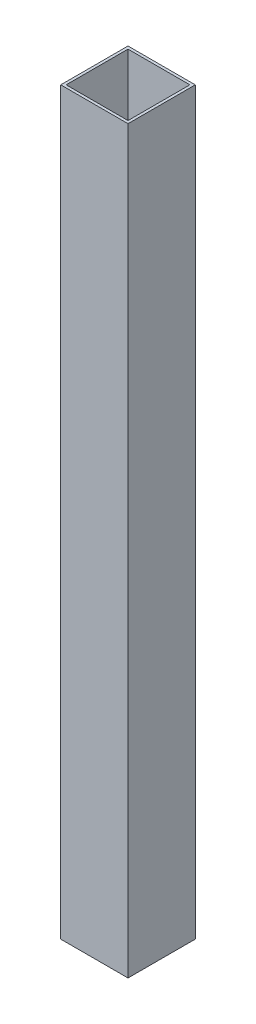
ISO-10303-21;
HEADER;
FILE_DESCRIPTION(('STEP AP214'),'2;1');
FILE_NAME('part.step','',(''),(''),'','','');
FILE_SCHEMA(('AUTOMOTIVE_DESIGN { 1 0 10303 214 1 1 1 1 }'));
ENDSEC;
DATA;
#1=APPLICATION_CONTEXT('core data for automotive mechanical design processes');
#2=APPLICATION_PROTOCOL_DEFINITION('international standard','automotive_design',2000,#1);
#3=PRODUCT_CONTEXT('',#1,'mechanical');
#4=PRODUCT('Part','Part','',(#3));
#5=PRODUCT_RELATED_PRODUCT_CATEGORY('part','',(#4));
#6=PRODUCT_DEFINITION_FORMATION('','',#4);
#7=PRODUCT_DEFINITION_CONTEXT('part definition',#1,'design');
#8=PRODUCT_DEFINITION('design','',#6,#7);
#9=PRODUCT_DEFINITION_SHAPE('','',#8);
#10=(LENGTH_UNIT() NAMED_UNIT(*) SI_UNIT(.MILLI.,.METRE.));
#11=(NAMED_UNIT(*) PLANE_ANGLE_UNIT() SI_UNIT($,.RADIAN.));
#12=(NAMED_UNIT(*) SI_UNIT($,.STERADIAN.) SOLID_ANGLE_UNIT());
#13=UNCERTAINTY_MEASURE_WITH_UNIT(LENGTH_MEASURE(1.E-05),#10,'distance_accuracy_value','');
#14=(GEOMETRIC_REPRESENTATION_CONTEXT(3) GLOBAL_UNCERTAINTY_ASSIGNED_CONTEXT((#13)) GLOBAL_UNIT_ASSIGNED_CONTEXT((#10,
#11,#12)) REPRESENTATION_CONTEXT('',''));
#15=CARTESIAN_POINT('',(0.,0.,0.));
#16=DIRECTION('',(0.,0.,1.));
#17=DIRECTION('',(1.,0.,0.));
#18=AXIS2_PLACEMENT_3D('',#15,#16,#17);
#19=CARTESIAN_POINT('',(0.,419.1,0.));
#20=DIRECTION('',(0.,1.,0.));
#21=DIRECTION('',(0.,0.,1.));
#22=AXIS2_PLACEMENT_3D('',#19,#20,#21);
#23=PLANE('',#22);
#24=DIRECTION('',(0.,0.,1.));
#25=VECTOR('',#24,1.);
#26=CARTESIAN_POINT('',(-19.05,419.1,-19.05));
#27=LINE('',#26,#25);
#28=CARTESIAN_POINT('',(-19.05,419.1,-19.05));
#29=VERTEX_POINT('',#28);
#30=CARTESIAN_POINT('',(-19.05,419.1,19.05));
#31=VERTEX_POINT('',#30);
#32=EDGE_CURVE('E162',#29,#31,#27,.T.);
#33=ORIENTED_EDGE('',*,*,#32,.T.);
#34=DIRECTION('',(1.,0.,0.));
#35=VECTOR('',#34,1.);
#36=CARTESIAN_POINT('',(19.05,419.1,19.05));
#37=LINE('',#36,#35);
#38=CARTESIAN_POINT('',(19.05,419.1,19.05));
#39=VERTEX_POINT('',#38);
#40=EDGE_CURVE('E165',#31,#39,#37,.T.);
#41=ORIENTED_EDGE('',*,*,#40,.T.);
#42=DIRECTION('',(0.,0.,-1.));
#43=VECTOR('',#42,1.);
#44=CARTESIAN_POINT('',(19.05,419.1,-19.05));
#45=LINE('',#44,#43);
#46=CARTESIAN_POINT('',(19.05,419.1,-19.05));
#47=VERTEX_POINT('',#46);
#48=EDGE_CURVE('E168',#39,#47,#45,.T.);
#49=ORIENTED_EDGE('',*,*,#48,.T.);
#50=DIRECTION('',(-1.,0.,0.));
#51=VECTOR('',#50,1.);
#52=CARTESIAN_POINT('',(19.05,419.1,-19.05));
#53=LINE('',#52,#51);
#54=EDGE_CURVE('E170',#47,#29,#53,.T.);
#55=ORIENTED_EDGE('',*,*,#54,.T.);
#56=EDGE_LOOP('',(#33,#41,#49,#55));
#57=FACE_BOUND('',#56,.T.);
#58=DIRECTION('',(1.,0.,0.));
#59=VECTOR('',#58,1.);
#60=CARTESIAN_POINT('',(0.,419.1,17.526));
#61=LINE('',#60,#59);
#62=CARTESIAN_POINT('',(-17.526,419.1,17.526));
#63=VERTEX_POINT('',#62);
#64=CARTESIAN_POINT('',(17.526,419.1,17.526));
#65=VERTEX_POINT('',#64);
#66=EDGE_CURVE('E134',#63,#65,#61,.T.);
#67=ORIENTED_EDGE('',*,*,#66,.F.);
#68=DIRECTION('',(0.,0.,1.));
#69=VECTOR('',#68,1.);
#70=CARTESIAN_POINT('',(-17.526,419.1,0.));
#71=LINE('',#70,#69);
#72=CARTESIAN_POINT('',(-17.526,419.1,-17.526));
#73=VERTEX_POINT('',#72);
#74=EDGE_CURVE('E126',#73,#63,#71,.T.);
#75=ORIENTED_EDGE('',*,*,#74,.F.);
#76=DIRECTION('',(-1.,0.,0.));
#77=VECTOR('',#76,1.);
#78=CARTESIAN_POINT('',(0.,419.1,-17.526));
#79=LINE('',#78,#77);
#80=CARTESIAN_POINT('',(17.526,419.1,-17.526));
#81=VERTEX_POINT('',#80);
#82=EDGE_CURVE('E148',#81,#73,#79,.T.);
#83=ORIENTED_EDGE('',*,*,#82,.F.);
#84=DIRECTION('',(0.,0.,-1.));
#85=VECTOR('',#84,1.);
#86=CARTESIAN_POINT('',(17.526,419.1,0.));
#87=LINE('',#86,#85);
#88=EDGE_CURVE('E146',#65,#81,#87,.T.);
#89=ORIENTED_EDGE('',*,*,#88,.F.);
#90=EDGE_LOOP('',(#67,#75,#83,#89));
#91=FACE_BOUND('',#90,.T.);
#92=ADVANCED_FACE('F61',(#57,#91),#23,.T.);
#93=CARTESIAN_POINT('',(0.,0.,0.));
#94=DIRECTION('',(0.,1.,0.));
#95=DIRECTION('',(0.,0.,1.));
#96=AXIS2_PLACEMENT_3D('',#93,#94,#95);
#97=PLANE('',#96);
#98=DIRECTION('',(0.,0.,1.));
#99=VECTOR('',#98,1.);
#100=CARTESIAN_POINT('',(-19.05,0.,-19.05));
#101=LINE('',#100,#99);
#102=CARTESIAN_POINT('',(-19.05,0.,-19.05));
#103=VERTEX_POINT('',#102);
#104=CARTESIAN_POINT('',(-19.05,0.,19.05));
#105=VERTEX_POINT('',#104);
#106=EDGE_CURVE('E142',#103,#105,#101,.T.);
#107=ORIENTED_EDGE('',*,*,#106,.F.);
#108=DIRECTION('',(-1.,0.,0.));
#109=VECTOR('',#108,1.);
#110=CARTESIAN_POINT('',(19.05,0.,-19.05));
#111=LINE('',#110,#109);
#112=CARTESIAN_POINT('',(19.05,0.,-19.05));
#113=VERTEX_POINT('',#112);
#114=EDGE_CURVE('E166',#113,#103,#111,.T.);
#115=ORIENTED_EDGE('',*,*,#114,.F.);
#116=DIRECTION('',(0.,0.,-1.));
#117=VECTOR('',#116,1.);
#118=CARTESIAN_POINT('',(19.05,0.,-19.05));
#119=LINE('',#118,#117);
#120=CARTESIAN_POINT('',(19.05,0.,19.05));
#121=VERTEX_POINT('',#120);
#122=EDGE_CURVE('E177',#121,#113,#119,.T.);
#123=ORIENTED_EDGE('',*,*,#122,.F.);
#124=DIRECTION('',(1.,0.,0.));
#125=VECTOR('',#124,1.);
#126=CARTESIAN_POINT('',(19.05,0.,19.05));
#127=LINE('',#126,#125);
#128=EDGE_CURVE('E175',#105,#121,#127,.T.);
#129=ORIENTED_EDGE('',*,*,#128,.F.);
#130=EDGE_LOOP('',(#107,#115,#123,#129));
#131=FACE_BOUND('',#130,.T.);
#132=DIRECTION('',(0.,0.,1.));
#133=VECTOR('',#132,1.);
#134=CARTESIAN_POINT('',(-17.526,0.,0.));
#135=LINE('',#134,#133);
#136=CARTESIAN_POINT('',(-17.526,0.,-17.526));
#137=VERTEX_POINT('',#136);
#138=CARTESIAN_POINT('',(-17.526,0.,17.526));
#139=VERTEX_POINT('',#138);
#140=EDGE_CURVE('E84',#137,#139,#135,.T.);
#141=ORIENTED_EDGE('',*,*,#140,.T.);
#142=DIRECTION('',(1.,0.,0.));
#143=VECTOR('',#142,1.);
#144=CARTESIAN_POINT('',(0.,0.,17.526));
#145=LINE('',#144,#143);
#146=CARTESIAN_POINT('',(17.526,0.,17.526));
#147=VERTEX_POINT('',#146);
#148=EDGE_CURVE('E141',#139,#147,#145,.T.);
#149=ORIENTED_EDGE('',*,*,#148,.T.);
#150=DIRECTION('',(0.,0.,-1.));
#151=VECTOR('',#150,1.);
#152=CARTESIAN_POINT('',(17.526,0.,0.));
#153=LINE('',#152,#151);
#154=CARTESIAN_POINT('',(17.526,0.,-17.526));
#155=VERTEX_POINT('',#154);
#156=EDGE_CURVE('E154',#147,#155,#153,.T.);
#157=ORIENTED_EDGE('',*,*,#156,.T.);
#158=DIRECTION('',(-1.,0.,0.));
#159=VECTOR('',#158,1.);
#160=CARTESIAN_POINT('',(0.,0.,-17.526));
#161=LINE('',#160,#159);
#162=EDGE_CURVE('E135',#155,#137,#161,.T.);
#163=ORIENTED_EDGE('',*,*,#162,.T.);
#164=EDGE_LOOP('',(#141,#149,#157,#163));
#165=FACE_BOUND('',#164,.T.);
#166=ADVANCED_FACE('F195',(#131,#165),#97,.F.);
#167=CARTESIAN_POINT('',(-19.05,419.1,-19.05));
#168=DIRECTION('',(1.,0.,0.));
#169=DIRECTION('',(0.,0.,-1.));
#170=AXIS2_PLACEMENT_3D('',#167,#168,#169);
#171=PLANE('',#170);
#172=ORIENTED_EDGE('',*,*,#106,.T.);
#173=DIRECTION('',(0.,-1.,0.));
#174=VECTOR('',#173,1.);
#175=CARTESIAN_POINT('',(-19.05,419.1,19.05));
#176=LINE('',#175,#174);
#177=EDGE_CURVE('E12',#31,#105,#176,.T.);
#178=ORIENTED_EDGE('',*,*,#177,.F.);
#179=ORIENTED_EDGE('',*,*,#32,.F.);
#180=DIRECTION('',(0.,-1.,0.));
#181=VECTOR('',#180,1.);
#182=CARTESIAN_POINT('',(-19.05,419.1,-19.05));
#183=LINE('',#182,#181);
#184=EDGE_CURVE('E172',#29,#103,#183,.T.);
#185=ORIENTED_EDGE('',*,*,#184,.T.);
#186=EDGE_LOOP('',(#172,#178,#179,#185));
#187=FACE_BOUND('',#186,.T.);
#188=ADVANCED_FACE('F63',(#187),#171,.F.);
#189=CARTESIAN_POINT('',(19.05,419.1,19.05));
#190=DIRECTION('',(0.,0.,-1.));
#191=DIRECTION('',(-1.,0.,0.));
#192=AXIS2_PLACEMENT_3D('',#189,#190,#191);
#193=PLANE('',#192);
#194=ORIENTED_EDGE('',*,*,#128,.T.);
#195=DIRECTION('',(0.,-1.,0.));
#196=VECTOR('',#195,1.);
#197=CARTESIAN_POINT('',(19.05,419.1,19.05));
#198=LINE('',#197,#196);
#199=EDGE_CURVE('E69',#39,#121,#198,.T.);
#200=ORIENTED_EDGE('',*,*,#199,.F.);
#201=ORIENTED_EDGE('',*,*,#40,.F.);
#202=ORIENTED_EDGE('',*,*,#177,.T.);
#203=EDGE_LOOP('',(#194,#200,#201,#202));
#204=FACE_BOUND('',#203,.T.);
#205=ADVANCED_FACE('F205',(#204),#193,.F.);
#206=CARTESIAN_POINT('',(19.05,419.1,-19.05));
#207=DIRECTION('',(-1.,0.,0.));
#208=DIRECTION('',(0.,0.,1.));
#209=AXIS2_PLACEMENT_3D('',#206,#207,#208);
#210=PLANE('',#209);
#211=ORIENTED_EDGE('',*,*,#122,.T.);
#212=DIRECTION('',(0.,-1.,0.));
#213=VECTOR('',#212,1.);
#214=CARTESIAN_POINT('',(19.05,419.1,-19.05));
#215=LINE('',#214,#213);
#216=EDGE_CURVE('E182',#47,#113,#215,.T.);
#217=ORIENTED_EDGE('',*,*,#216,.F.);
#218=ORIENTED_EDGE('',*,*,#48,.F.);
#219=ORIENTED_EDGE('',*,*,#199,.T.);
#220=EDGE_LOOP('',(#211,#217,#218,#219));
#221=FACE_BOUND('',#220,.T.);
#222=ADVANCED_FACE('F189',(#221),#210,.F.);
#223=CARTESIAN_POINT('',(19.05,419.1,-19.05));
#224=DIRECTION('',(0.,0.,1.));
#225=DIRECTION('',(1.,0.,0.));
#226=AXIS2_PLACEMENT_3D('',#223,#224,#225);
#227=PLANE('',#226);
#228=ORIENTED_EDGE('',*,*,#114,.T.);
#229=ORIENTED_EDGE('',*,*,#184,.F.);
#230=ORIENTED_EDGE('',*,*,#54,.F.);
#231=ORIENTED_EDGE('',*,*,#216,.T.);
#232=EDGE_LOOP('',(#228,#229,#230,#231));
#233=FACE_BOUND('',#232,.T.);
#234=ADVANCED_FACE('F199',(#233),#227,.F.);
#235=CARTESIAN_POINT('',(-17.526,419.1,0.));
#236=DIRECTION('',(1.,0.,0.));
#237=DIRECTION('',(0.,0.,-1.));
#238=AXIS2_PLACEMENT_3D('',#235,#236,#237);
#239=PLANE('',#238);
#240=ORIENTED_EDGE('',*,*,#140,.F.);
#241=DIRECTION('',(0.,-1.,0.));
#242=VECTOR('',#241,1.);
#243=CARTESIAN_POINT('',(-17.526,419.1,-17.526));
#244=LINE('',#243,#242);
#245=EDGE_CURVE('E130',#73,#137,#244,.T.);
#246=ORIENTED_EDGE('',*,*,#245,.F.);
#247=ORIENTED_EDGE('',*,*,#74,.T.);
#248=DIRECTION('',(0.,-1.,0.));
#249=VECTOR('',#248,1.);
#250=CARTESIAN_POINT('',(-17.526,419.1,17.526));
#251=LINE('',#250,#249);
#252=EDGE_CURVE('E129',#63,#139,#251,.T.);
#253=ORIENTED_EDGE('',*,*,#252,.T.);
#254=EDGE_LOOP('',(#240,#246,#247,#253));
#255=FACE_BOUND('',#254,.T.);
#256=ADVANCED_FACE('F128',(#255),#239,.T.);
#257=CARTESIAN_POINT('',(0.,419.1,17.526));
#258=DIRECTION('',(0.,0.,-1.));
#259=DIRECTION('',(-1.,0.,0.));
#260=AXIS2_PLACEMENT_3D('',#257,#258,#259);
#261=PLANE('',#260);
#262=ORIENTED_EDGE('',*,*,#148,.F.);
#263=ORIENTED_EDGE('',*,*,#252,.F.);
#264=ORIENTED_EDGE('',*,*,#66,.T.);
#265=DIRECTION('',(0.,-1.,0.));
#266=VECTOR('',#265,1.);
#267=CARTESIAN_POINT('',(17.526,419.1,17.526));
#268=LINE('',#267,#266);
#269=EDGE_CURVE('E143',#65,#147,#268,.T.);
#270=ORIENTED_EDGE('',*,*,#269,.T.);
#271=EDGE_LOOP('',(#262,#263,#264,#270));
#272=FACE_BOUND('',#271,.T.);
#273=ADVANCED_FACE('F138',(#272),#261,.T.);
#274=CARTESIAN_POINT('',(17.526,419.1,0.));
#275=DIRECTION('',(-1.,0.,0.));
#276=DIRECTION('',(0.,0.,1.));
#277=AXIS2_PLACEMENT_3D('',#274,#275,#276);
#278=PLANE('',#277);
#279=ORIENTED_EDGE('',*,*,#156,.F.);
#280=ORIENTED_EDGE('',*,*,#269,.F.);
#281=ORIENTED_EDGE('',*,*,#88,.T.);
#282=DIRECTION('',(0.,-1.,0.));
#283=VECTOR('',#282,1.);
#284=CARTESIAN_POINT('',(17.526,419.1,-17.526));
#285=LINE('',#284,#283);
#286=EDGE_CURVE('E76',#81,#155,#285,.T.);
#287=ORIENTED_EDGE('',*,*,#286,.T.);
#288=EDGE_LOOP('',(#279,#280,#281,#287));
#289=FACE_BOUND('',#288,.T.);
#290=ADVANCED_FACE('F228',(#289),#278,.T.);
#291=CARTESIAN_POINT('',(0.,419.1,-17.526));
#292=DIRECTION('',(0.,0.,1.));
#293=DIRECTION('',(1.,0.,0.));
#294=AXIS2_PLACEMENT_3D('',#291,#292,#293);
#295=PLANE('',#294);
#296=ORIENTED_EDGE('',*,*,#162,.F.);
#297=ORIENTED_EDGE('',*,*,#286,.F.);
#298=ORIENTED_EDGE('',*,*,#82,.T.);
#299=ORIENTED_EDGE('',*,*,#245,.T.);
#300=EDGE_LOOP('',(#296,#297,#298,#299));
#301=FACE_BOUND('',#300,.T.);
#302=ADVANCED_FACE('F232',(#301),#295,.T.);
#303=CLOSED_SHELL('',(#92,#166,#188,#205,#222,#234,#256,#273,#290,#302));
#304=MANIFOLD_SOLID_BREP('B2',#303);
#305=ADVANCED_BREP_SHAPE_REPRESENTATION('',(#18,#304),#14);
#306=SHAPE_DEFINITION_REPRESENTATION(#9,#305);
ENDSEC;
END-ISO-10303-21;
